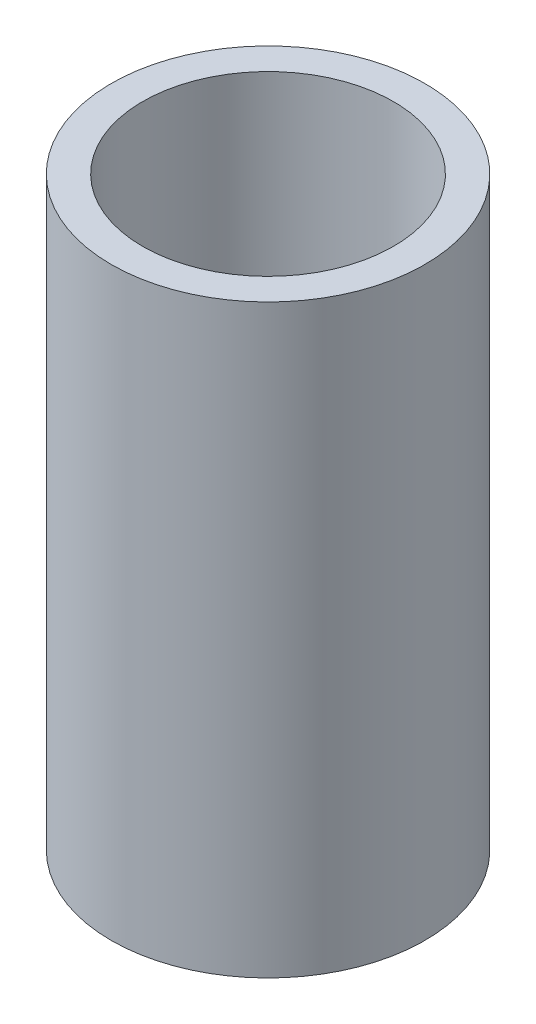
ISO-10303-21;
HEADER;
FILE_DESCRIPTION(('STEP AP214'),'2;1');
FILE_NAME('part.step','',(''),(''),'','','');
FILE_SCHEMA(('AUTOMOTIVE_DESIGN { 1 0 10303 214 1 1 1 1 }'));
ENDSEC;
DATA;
#1=APPLICATION_CONTEXT('core data for automotive mechanical design processes');
#2=APPLICATION_PROTOCOL_DEFINITION('international standard','automotive_design',2000,#1);
#3=PRODUCT_CONTEXT('',#1,'mechanical');
#4=PRODUCT('Part','Part','',(#3));
#5=PRODUCT_RELATED_PRODUCT_CATEGORY('part','',(#4));
#6=PRODUCT_DEFINITION_FORMATION('','',#4);
#7=PRODUCT_DEFINITION_CONTEXT('part definition',#1,'design');
#8=PRODUCT_DEFINITION('design','',#6,#7);
#9=PRODUCT_DEFINITION_SHAPE('','',#8);
#10=(LENGTH_UNIT() NAMED_UNIT(*) SI_UNIT(.MILLI.,.METRE.));
#11=(NAMED_UNIT(*) PLANE_ANGLE_UNIT() SI_UNIT($,.RADIAN.));
#12=(NAMED_UNIT(*) SI_UNIT($,.STERADIAN.) SOLID_ANGLE_UNIT());
#13=UNCERTAINTY_MEASURE_WITH_UNIT(LENGTH_MEASURE(1.E-05),#10,'distance_accuracy_value','');
#14=(GEOMETRIC_REPRESENTATION_CONTEXT(3) GLOBAL_UNCERTAINTY_ASSIGNED_CONTEXT((#13)) GLOBAL_UNIT_ASSIGNED_CONTEXT((#10,
#11,#12)) REPRESENTATION_CONTEXT('',''));
#15=CARTESIAN_POINT('',(0.,0.,0.));
#16=DIRECTION('',(0.,0.,1.));
#17=DIRECTION('',(1.,0.,0.));
#18=AXIS2_PLACEMENT_3D('',#15,#16,#17);
#19=CARTESIAN_POINT('',(0.,14.,0.));
#20=DIRECTION('',(0.,1.,0.));
#21=DIRECTION('',(0.,0.,1.));
#22=AXIS2_PLACEMENT_3D('',#19,#20,#21);
#23=PLANE('',#22);
#24=CARTESIAN_POINT('',(0.,14.,0.));
#25=DIRECTION('',(0.,1.,0.));
#26=DIRECTION('',(0.,0.,1.));
#27=AXIS2_PLACEMENT_3D('',#24,#25,#26);
#28=CIRCLE('',#27,7.5);
#29=CARTESIAN_POINT('',(0.,14.,7.5));
#30=VERTEX_POINT('',#29);
#31=EDGE_CURVE('E10',#30,#30,#28,.T.);
#32=ORIENTED_EDGE('',*,*,#31,.T.);
#33=EDGE_LOOP('',(#32));
#34=FACE_BOUND('',#33,.T.);
#35=CARTESIAN_POINT('',(0.,14.,0.));
#36=DIRECTION('',(0.,1.,0.));
#37=DIRECTION('',(0.,0.,1.));
#38=AXIS2_PLACEMENT_3D('',#35,#36,#37);
#39=CIRCLE('',#38,6.);
#40=CARTESIAN_POINT('',(0.,14.,6.));
#41=VERTEX_POINT('',#40);
#42=EDGE_CURVE('E46',#41,#41,#39,.T.);
#43=ORIENTED_EDGE('',*,*,#42,.F.);
#44=EDGE_LOOP('',(#43));
#45=FACE_BOUND('',#44,.T.);
#46=ADVANCED_FACE('F32',(#34,#45),#23,.T.);
#47=CARTESIAN_POINT('',(0.,-14.,0.));
#48=DIRECTION('',(0.,1.,0.));
#49=DIRECTION('',(0.,0.,1.));
#50=AXIS2_PLACEMENT_3D('',#47,#48,#49);
#51=PLANE('',#50);
#52=CARTESIAN_POINT('',(0.,-14.,0.));
#53=DIRECTION('',(0.,1.,0.));
#54=DIRECTION('',(0.,0.,1.));
#55=AXIS2_PLACEMENT_3D('',#52,#53,#54);
#56=CIRCLE('',#55,7.5);
#57=CARTESIAN_POINT('',(0.,-14.,7.5));
#58=VERTEX_POINT('',#57);
#59=EDGE_CURVE('E36',#58,#58,#56,.T.);
#60=ORIENTED_EDGE('',*,*,#59,.F.);
#61=EDGE_LOOP('',(#60));
#62=FACE_BOUND('',#61,.T.);
#63=CARTESIAN_POINT('',(0.,-14.,0.));
#64=DIRECTION('',(0.,1.,0.));
#65=DIRECTION('',(0.,0.,1.));
#66=AXIS2_PLACEMENT_3D('',#63,#64,#65);
#67=CIRCLE('',#66,6.);
#68=CARTESIAN_POINT('',(0.,-14.,6.));
#69=VERTEX_POINT('',#68);
#70=EDGE_CURVE('E48',#69,#69,#67,.T.);
#71=ORIENTED_EDGE('',*,*,#70,.T.);
#72=EDGE_LOOP('',(#71));
#73=FACE_BOUND('',#72,.T.);
#74=ADVANCED_FACE('F61',(#62,#73),#51,.F.);
#75=CARTESIAN_POINT('',(0.,14.,0.));
#76=DIRECTION('',(0.,-1.,0.));
#77=DIRECTION('',(0.,0.,-1.));
#78=AXIS2_PLACEMENT_3D('',#75,#76,#77);
#79=CYLINDRICAL_SURFACE('',#78,7.5);
#80=ORIENTED_EDGE('',*,*,#31,.F.);
#81=EDGE_LOOP('',(#80));
#82=FACE_BOUND('',#81,.T.);
#83=ORIENTED_EDGE('',*,*,#59,.T.);
#84=EDGE_LOOP('',(#83));
#85=FACE_BOUND('',#84,.T.);
#86=ADVANCED_FACE('F34',(#82,#85),#79,.T.);
#87=CARTESIAN_POINT('',(0.,14.,0.));
#88=DIRECTION('',(0.,-1.,0.));
#89=DIRECTION('',(0.,0.,-1.));
#90=AXIS2_PLACEMENT_3D('',#87,#88,#89);
#91=CYLINDRICAL_SURFACE('',#90,6.);
#92=ORIENTED_EDGE('',*,*,#42,.T.);
#93=EDGE_LOOP('',(#92));
#94=FACE_BOUND('',#93,.T.);
#95=ORIENTED_EDGE('',*,*,#70,.F.);
#96=EDGE_LOOP('',(#95));
#97=FACE_BOUND('',#96,.T.);
#98=ADVANCED_FACE('F57',(#94,#97),#91,.F.);
#99=CLOSED_SHELL('',(#46,#74,#86,#98));
#100=MANIFOLD_SOLID_BREP('B2',#99);
#101=ADVANCED_BREP_SHAPE_REPRESENTATION('',(#18,#100),#14);
#102=SHAPE_DEFINITION_REPRESENTATION(#9,#101);
ENDSEC;
END-ISO-10303-21;
